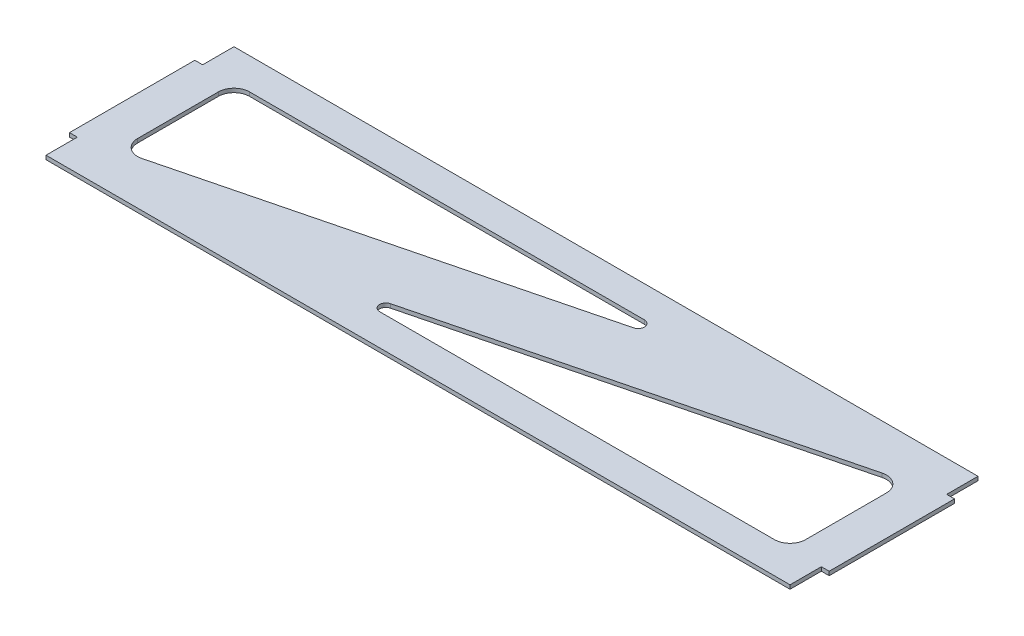
ISO-10303-21;
HEADER;
FILE_DESCRIPTION(('STEP AP214'),'2;1');
FILE_NAME('part.step','',(''),(''),'','','');
FILE_SCHEMA(('AUTOMOTIVE_DESIGN { 1 0 10303 214 1 1 1 1 }'));
ENDSEC;
DATA;
#1=APPLICATION_CONTEXT('core data for automotive mechanical design processes');
#2=APPLICATION_PROTOCOL_DEFINITION('international standard','automotive_design',2000,#1);
#3=PRODUCT_CONTEXT('',#1,'mechanical');
#4=PRODUCT('Part','Part','',(#3));
#5=PRODUCT_RELATED_PRODUCT_CATEGORY('part','',(#4));
#6=PRODUCT_DEFINITION_FORMATION('','',#4);
#7=PRODUCT_DEFINITION_CONTEXT('part definition',#1,'design');
#8=PRODUCT_DEFINITION('design','',#6,#7);
#9=PRODUCT_DEFINITION_SHAPE('','',#8);
#10=(LENGTH_UNIT() NAMED_UNIT(*) SI_UNIT(.MILLI.,.METRE.));
#11=(NAMED_UNIT(*) PLANE_ANGLE_UNIT() SI_UNIT($,.RADIAN.));
#12=(NAMED_UNIT(*) SI_UNIT($,.STERADIAN.) SOLID_ANGLE_UNIT());
#13=UNCERTAINTY_MEASURE_WITH_UNIT(LENGTH_MEASURE(1.E-05),#10,'distance_accuracy_value','');
#14=(GEOMETRIC_REPRESENTATION_CONTEXT(3) GLOBAL_UNCERTAINTY_ASSIGNED_CONTEXT((#13)) GLOBAL_UNIT_ASSIGNED_CONTEXT((#10,
#11,#12)) REPRESENTATION_CONTEXT('',''));
#15=CARTESIAN_POINT('',(0.,0.,0.));
#16=DIRECTION('',(0.,0.,1.));
#17=DIRECTION('',(1.,0.,0.));
#18=AXIS2_PLACEMENT_3D('',#15,#16,#17);
#19=CARTESIAN_POINT('',(-150.8125,1.5875,0.));
#20=DIRECTION('',(-1.,0.,0.));
#21=DIRECTION('',(0.,0.,1.));
#22=AXIS2_PLACEMENT_3D('',#19,#20,#21);
#23=PLANE('',#22);
#24=DIRECTION('',(0.,0.,-1.));
#25=VECTOR('',#24,1.);
#26=CARTESIAN_POINT('',(-150.8125,0.,0.));
#27=LINE('',#26,#25);
#28=CARTESIAN_POINT('',(-150.8125,0.,-25.4));
#29=VERTEX_POINT('',#28);
#30=CARTESIAN_POINT('',(-150.8125,0.,-38.1));
#31=VERTEX_POINT('',#30);
#32=EDGE_CURVE('E324',#29,#31,#27,.T.);
#33=ORIENTED_EDGE('',*,*,#32,.F.);
#34=DIRECTION('',(0.,-1.,0.));
#35=VECTOR('',#34,1.);
#36=CARTESIAN_POINT('',(-150.8125,1.5875,-25.4));
#37=LINE('',#36,#35);
#38=CARTESIAN_POINT('',(-150.8125,1.5875,-25.4));
#39=VERTEX_POINT('',#38);
#40=EDGE_CURVE('E11',#39,#29,#37,.T.);
#41=ORIENTED_EDGE('',*,*,#40,.F.);
#42=DIRECTION('',(0.,0.,-1.));
#43=VECTOR('',#42,1.);
#44=CARTESIAN_POINT('',(-150.8125,1.5875,0.));
#45=LINE('',#44,#43);
#46=CARTESIAN_POINT('',(-150.8125,1.5875,-38.1));
#47=VERTEX_POINT('',#46);
#48=EDGE_CURVE('E339',#39,#47,#45,.T.);
#49=ORIENTED_EDGE('',*,*,#48,.T.);
#50=DIRECTION('',(0.,-1.,0.));
#51=VECTOR('',#50,1.);
#52=CARTESIAN_POINT('',(-150.8125,1.5875,-38.1));
#53=LINE('',#52,#51);
#54=EDGE_CURVE('E379',#47,#31,#53,.T.);
#55=ORIENTED_EDGE('',*,*,#54,.T.);
#56=EDGE_LOOP('',(#33,#41,#49,#55));
#57=FACE_BOUND('',#56,.T.);
#58=ADVANCED_FACE('F41',(#57),#23,.T.);
#59=CARTESIAN_POINT('',(0.,1.5875,-25.4));
#60=DIRECTION('',(0.,0.,1.));
#61=DIRECTION('',(1.,0.,0.));
#62=AXIS2_PLACEMENT_3D('',#59,#60,#61);
#63=PLANE('',#62);
#64=DIRECTION('',(-1.,0.,0.));
#65=VECTOR('',#64,1.);
#66=CARTESIAN_POINT('',(0.,0.,-25.4));
#67=LINE('',#66,#65);
#68=CARTESIAN_POINT('',(-153.9875,0.,-25.4));
#69=VERTEX_POINT('',#68);
#70=EDGE_CURVE('E383',#29,#69,#67,.T.);
#71=ORIENTED_EDGE('',*,*,#70,.T.);
#72=DIRECTION('',(0.,-1.,0.));
#73=VECTOR('',#72,1.);
#74=CARTESIAN_POINT('',(-153.9875,1.5875,-25.4));
#75=LINE('',#74,#73);
#76=CARTESIAN_POINT('',(-153.9875,1.5875,-25.4));
#77=VERTEX_POINT('',#76);
#78=EDGE_CURVE('E49',#77,#69,#75,.T.);
#79=ORIENTED_EDGE('',*,*,#78,.F.);
#80=DIRECTION('',(-1.,0.,0.));
#81=VECTOR('',#80,1.);
#82=CARTESIAN_POINT('',(0.,1.5875,-25.4));
#83=LINE('',#82,#81);
#84=EDGE_CURVE('E343',#39,#77,#83,.T.);
#85=ORIENTED_EDGE('',*,*,#84,.F.);
#86=ORIENTED_EDGE('',*,*,#40,.T.);
#87=EDGE_LOOP('',(#71,#79,#85,#86));
#88=FACE_BOUND('',#87,.T.);
#89=ADVANCED_FACE('F478',(#88),#63,.F.);
#90=CARTESIAN_POINT('',(-153.9875,1.5875,0.));
#91=DIRECTION('',(1.,0.,0.));
#92=DIRECTION('',(0.,0.,-1.));
#93=AXIS2_PLACEMENT_3D('',#90,#91,#92);
#94=PLANE('',#93);
#95=DIRECTION('',(0.,0.,1.));
#96=VECTOR('',#95,1.);
#97=CARTESIAN_POINT('',(-153.9875,0.,0.));
#98=LINE('',#97,#96);
#99=CARTESIAN_POINT('',(-153.9875,0.,25.4));
#100=VERTEX_POINT('',#99);
#101=EDGE_CURVE('E386',#69,#100,#98,.T.);
#102=ORIENTED_EDGE('',*,*,#101,.T.);
#103=DIRECTION('',(0.,-1.,0.));
#104=VECTOR('',#103,1.);
#105=CARTESIAN_POINT('',(-153.9875,1.5875,25.4));
#106=LINE('',#105,#104);
#107=CARTESIAN_POINT('',(-153.9875,1.5875,25.4));
#108=VERTEX_POINT('',#107);
#109=EDGE_CURVE('E450',#108,#100,#106,.T.);
#110=ORIENTED_EDGE('',*,*,#109,.F.);
#111=DIRECTION('',(0.,0.,1.));
#112=VECTOR('',#111,1.);
#113=CARTESIAN_POINT('',(-153.9875,1.5875,0.));
#114=LINE('',#113,#112);
#115=EDGE_CURVE('E347',#77,#108,#114,.T.);
#116=ORIENTED_EDGE('',*,*,#115,.F.);
#117=ORIENTED_EDGE('',*,*,#78,.T.);
#118=EDGE_LOOP('',(#102,#110,#116,#117));
#119=FACE_BOUND('',#118,.T.);
#120=ADVANCED_FACE('F459',(#119),#94,.F.);
#121=CARTESIAN_POINT('',(0.,1.5875,25.4));
#122=DIRECTION('',(0.,0.,-1.));
#123=DIRECTION('',(-1.,0.,0.));
#124=AXIS2_PLACEMENT_3D('',#121,#122,#123);
#125=PLANE('',#124);
#126=DIRECTION('',(1.,0.,0.));
#127=VECTOR('',#126,1.);
#128=CARTESIAN_POINT('',(0.,0.,25.4));
#129=LINE('',#128,#127);
#130=CARTESIAN_POINT('',(-150.8125,0.,25.4));
#131=VERTEX_POINT('',#130);
#132=EDGE_CURVE('E389',#100,#131,#129,.T.);
#133=ORIENTED_EDGE('',*,*,#132,.T.);
#134=DIRECTION('',(0.,-1.,0.));
#135=VECTOR('',#134,1.);
#136=CARTESIAN_POINT('',(-150.8125,1.5875,25.4));
#137=LINE('',#136,#135);
#138=CARTESIAN_POINT('',(-150.8125,1.5875,25.4));
#139=VERTEX_POINT('',#138);
#140=EDGE_CURVE('E447',#139,#131,#137,.T.);
#141=ORIENTED_EDGE('',*,*,#140,.F.);
#142=DIRECTION('',(1.,0.,0.));
#143=VECTOR('',#142,1.);
#144=CARTESIAN_POINT('',(0.,1.5875,25.4));
#145=LINE('',#144,#143);
#146=EDGE_CURVE('E350',#108,#139,#145,.T.);
#147=ORIENTED_EDGE('',*,*,#146,.F.);
#148=ORIENTED_EDGE('',*,*,#109,.T.);
#149=EDGE_LOOP('',(#133,#141,#147,#148));
#150=FACE_BOUND('',#149,.T.);
#151=ADVANCED_FACE('F471',(#150),#125,.F.);
#152=CARTESIAN_POINT('',(-150.8125,1.5875,0.));
#153=DIRECTION('',(-1.,0.,0.));
#154=DIRECTION('',(0.,0.,1.));
#155=AXIS2_PLACEMENT_3D('',#152,#153,#154);
#156=PLANE('',#155);
#157=DIRECTION('',(0.,0.,-1.));
#158=VECTOR('',#157,1.);
#159=CARTESIAN_POINT('',(-150.8125,0.,0.));
#160=LINE('',#159,#158);
#161=CARTESIAN_POINT('',(-150.8125,0.,38.1));
#162=VERTEX_POINT('',#161);
#163=EDGE_CURVE('E393',#162,#131,#160,.T.);
#164=ORIENTED_EDGE('',*,*,#163,.F.);
#165=DIRECTION('',(0.,-1.,0.));
#166=VECTOR('',#165,1.);
#167=CARTESIAN_POINT('',(-150.8125,1.5875,38.1));
#168=LINE('',#167,#166);
#169=CARTESIAN_POINT('',(-150.8125,1.5875,38.1));
#170=VERTEX_POINT('',#169);
#171=EDGE_CURVE('E444',#170,#162,#168,.T.);
#172=ORIENTED_EDGE('',*,*,#171,.F.);
#173=DIRECTION('',(0.,0.,-1.));
#174=VECTOR('',#173,1.);
#175=CARTESIAN_POINT('',(-150.8125,1.5875,0.));
#176=LINE('',#175,#174);
#177=EDGE_CURVE('E353',#170,#139,#176,.T.);
#178=ORIENTED_EDGE('',*,*,#177,.T.);
#179=ORIENTED_EDGE('',*,*,#140,.T.);
#180=EDGE_LOOP('',(#164,#172,#178,#179));
#181=FACE_BOUND('',#180,.T.);
#182=ADVANCED_FACE('F513',(#181),#156,.T.);
#183=CARTESIAN_POINT('',(0.,1.5875,38.1));
#184=DIRECTION('',(0.,0.,-1.));
#185=DIRECTION('',(-1.,0.,0.));
#186=AXIS2_PLACEMENT_3D('',#183,#184,#185);
#187=PLANE('',#186);
#188=DIRECTION('',(1.,0.,0.));
#189=VECTOR('',#188,1.);
#190=CARTESIAN_POINT('',(0.,0.,38.1));
#191=LINE('',#190,#189);
#192=CARTESIAN_POINT('',(150.8125,0.,38.1));
#193=VERTEX_POINT('',#192);
#194=EDGE_CURVE('E397',#162,#193,#191,.T.);
#195=ORIENTED_EDGE('',*,*,#194,.T.);
#196=DIRECTION('',(0.,-1.,0.));
#197=VECTOR('',#196,1.);
#198=CARTESIAN_POINT('',(150.8125,1.5875,38.1));
#199=LINE('',#198,#197);
#200=CARTESIAN_POINT('',(150.8125,1.5875,38.1));
#201=VERTEX_POINT('',#200);
#202=EDGE_CURVE('E440',#201,#193,#199,.T.);
#203=ORIENTED_EDGE('',*,*,#202,.F.);
#204=DIRECTION('',(1.,0.,0.));
#205=VECTOR('',#204,1.);
#206=CARTESIAN_POINT('',(0.,1.5875,38.1));
#207=LINE('',#206,#205);
#208=EDGE_CURVE('E357',#170,#201,#207,.T.);
#209=ORIENTED_EDGE('',*,*,#208,.F.);
#210=ORIENTED_EDGE('',*,*,#171,.T.);
#211=EDGE_LOOP('',(#195,#203,#209,#210));
#212=FACE_BOUND('',#211,.T.);
#213=ADVANCED_FACE('F511',(#212),#187,.F.);
#214=CARTESIAN_POINT('',(150.8125,1.5875,0.));
#215=DIRECTION('',(-1.,0.,0.));
#216=DIRECTION('',(0.,0.,1.));
#217=AXIS2_PLACEMENT_3D('',#214,#215,#216);
#218=PLANE('',#217);
#219=DIRECTION('',(0.,0.,-1.));
#220=VECTOR('',#219,1.);
#221=CARTESIAN_POINT('',(150.8125,0.,0.));
#222=LINE('',#221,#220);
#223=CARTESIAN_POINT('',(150.8125,0.,25.4));
#224=VERTEX_POINT('',#223);
#225=EDGE_CURVE('E400',#193,#224,#222,.T.);
#226=ORIENTED_EDGE('',*,*,#225,.T.);
#227=DIRECTION('',(0.,-1.,0.));
#228=VECTOR('',#227,1.);
#229=CARTESIAN_POINT('',(150.8125,1.5875,25.4));
#230=LINE('',#229,#228);
#231=CARTESIAN_POINT('',(150.8125,1.5875,25.4));
#232=VERTEX_POINT('',#231);
#233=EDGE_CURVE('E436',#232,#224,#230,.T.);
#234=ORIENTED_EDGE('',*,*,#233,.F.);
#235=DIRECTION('',(0.,0.,-1.));
#236=VECTOR('',#235,1.);
#237=CARTESIAN_POINT('',(150.8125,1.5875,0.));
#238=LINE('',#237,#236);
#239=EDGE_CURVE('E360',#201,#232,#238,.T.);
#240=ORIENTED_EDGE('',*,*,#239,.F.);
#241=ORIENTED_EDGE('',*,*,#202,.T.);
#242=EDGE_LOOP('',(#226,#234,#240,#241));
#243=FACE_BOUND('',#242,.T.);
#244=ADVANCED_FACE('F506',(#243),#218,.F.);
#245=CARTESIAN_POINT('',(0.,1.5875,25.4));
#246=DIRECTION('',(0.,0.,-1.));
#247=DIRECTION('',(-1.,0.,0.));
#248=AXIS2_PLACEMENT_3D('',#245,#246,#247);
#249=PLANE('',#248);
#250=DIRECTION('',(1.,0.,0.));
#251=VECTOR('',#250,1.);
#252=CARTESIAN_POINT('',(0.,0.,25.4));
#253=LINE('',#252,#251);
#254=CARTESIAN_POINT('',(153.9875,0.,25.4));
#255=VERTEX_POINT('',#254);
#256=EDGE_CURVE('E403',#224,#255,#253,.T.);
#257=ORIENTED_EDGE('',*,*,#256,.T.);
#258=DIRECTION('',(0.,-1.,0.));
#259=VECTOR('',#258,1.);
#260=CARTESIAN_POINT('',(153.9875,1.5875,25.4));
#261=LINE('',#260,#259);
#262=CARTESIAN_POINT('',(153.9875,1.5875,25.4));
#263=VERTEX_POINT('',#262);
#264=EDGE_CURVE('E432',#263,#255,#261,.T.);
#265=ORIENTED_EDGE('',*,*,#264,.F.);
#266=DIRECTION('',(1.,0.,0.));
#267=VECTOR('',#266,1.);
#268=CARTESIAN_POINT('',(0.,1.5875,25.4));
#269=LINE('',#268,#267);
#270=EDGE_CURVE('E363',#232,#263,#269,.T.);
#271=ORIENTED_EDGE('',*,*,#270,.F.);
#272=ORIENTED_EDGE('',*,*,#233,.T.);
#273=EDGE_LOOP('',(#257,#265,#271,#272));
#274=FACE_BOUND('',#273,.T.);
#275=ADVANCED_FACE('F502',(#274),#249,.F.);
#276=CARTESIAN_POINT('',(153.9875,1.5875,0.));
#277=DIRECTION('',(-1.,0.,0.));
#278=DIRECTION('',(0.,0.,1.));
#279=AXIS2_PLACEMENT_3D('',#276,#277,#278);
#280=PLANE('',#279);
#281=DIRECTION('',(0.,0.,-1.));
#282=VECTOR('',#281,1.);
#283=CARTESIAN_POINT('',(153.9875,0.,0.));
#284=LINE('',#283,#282);
#285=CARTESIAN_POINT('',(153.9875,0.,-25.4));
#286=VERTEX_POINT('',#285);
#287=EDGE_CURVE('E406',#255,#286,#284,.T.);
#288=ORIENTED_EDGE('',*,*,#287,.T.);
#289=DIRECTION('',(0.,-1.,0.));
#290=VECTOR('',#289,1.);
#291=CARTESIAN_POINT('',(153.9875,1.5875,-25.4));
#292=LINE('',#291,#290);
#293=CARTESIAN_POINT('',(153.9875,1.5875,-25.4));
#294=VERTEX_POINT('',#293);
#295=EDGE_CURVE('E428',#294,#286,#292,.T.);
#296=ORIENTED_EDGE('',*,*,#295,.F.);
#297=DIRECTION('',(0.,0.,-1.));
#298=VECTOR('',#297,1.);
#299=CARTESIAN_POINT('',(153.9875,1.5875,0.));
#300=LINE('',#299,#298);
#301=EDGE_CURVE('E366',#263,#294,#300,.T.);
#302=ORIENTED_EDGE('',*,*,#301,.F.);
#303=ORIENTED_EDGE('',*,*,#264,.T.);
#304=EDGE_LOOP('',(#288,#296,#302,#303));
#305=FACE_BOUND('',#304,.T.);
#306=ADVANCED_FACE('F498',(#305),#280,.F.);
#307=CARTESIAN_POINT('',(0.,1.5875,-25.4));
#308=DIRECTION('',(0.,0.,1.));
#309=DIRECTION('',(1.,0.,0.));
#310=AXIS2_PLACEMENT_3D('',#307,#308,#309);
#311=PLANE('',#310);
#312=DIRECTION('',(-1.,0.,0.));
#313=VECTOR('',#312,1.);
#314=CARTESIAN_POINT('',(0.,0.,-25.4));
#315=LINE('',#314,#313);
#316=CARTESIAN_POINT('',(150.8125,0.,-25.4));
#317=VERTEX_POINT('',#316);
#318=EDGE_CURVE('E409',#286,#317,#315,.T.);
#319=ORIENTED_EDGE('',*,*,#318,.T.);
#320=DIRECTION('',(0.,-1.,0.));
#321=VECTOR('',#320,1.);
#322=CARTESIAN_POINT('',(150.8125,1.5875,-25.4));
#323=LINE('',#322,#321);
#324=CARTESIAN_POINT('',(150.8125,1.5875,-25.4));
#325=VERTEX_POINT('',#324);
#326=EDGE_CURVE('E424',#325,#317,#323,.T.);
#327=ORIENTED_EDGE('',*,*,#326,.F.);
#328=DIRECTION('',(-1.,0.,0.));
#329=VECTOR('',#328,1.);
#330=CARTESIAN_POINT('',(0.,1.5875,-25.4));
#331=LINE('',#330,#329);
#332=EDGE_CURVE('E369',#294,#325,#331,.T.);
#333=ORIENTED_EDGE('',*,*,#332,.F.);
#334=ORIENTED_EDGE('',*,*,#295,.T.);
#335=EDGE_LOOP('',(#319,#327,#333,#334));
#336=FACE_BOUND('',#335,.T.);
#337=ADVANCED_FACE('F493',(#336),#311,.F.);
#338=CARTESIAN_POINT('',(150.8125,1.5875,0.));
#339=DIRECTION('',(-1.,0.,0.));
#340=DIRECTION('',(0.,0.,1.));
#341=AXIS2_PLACEMENT_3D('',#338,#339,#340);
#342=PLANE('',#341);
#343=DIRECTION('',(0.,0.,-1.));
#344=VECTOR('',#343,1.);
#345=CARTESIAN_POINT('',(150.8125,0.,0.));
#346=LINE('',#345,#344);
#347=CARTESIAN_POINT('',(150.8125,0.,-38.1));
#348=VERTEX_POINT('',#347);
#349=EDGE_CURVE('E412',#317,#348,#346,.T.);
#350=ORIENTED_EDGE('',*,*,#349,.T.);
#351=DIRECTION('',(0.,-1.,0.));
#352=VECTOR('',#351,1.);
#353=CARTESIAN_POINT('',(150.8125,1.5875,-38.1));
#354=LINE('',#353,#352);
#355=CARTESIAN_POINT('',(150.8125,1.5875,-38.1));
#356=VERTEX_POINT('',#355);
#357=EDGE_CURVE('E421',#356,#348,#354,.T.);
#358=ORIENTED_EDGE('',*,*,#357,.F.);
#359=DIRECTION('',(0.,0.,-1.));
#360=VECTOR('',#359,1.);
#361=CARTESIAN_POINT('',(150.8125,1.5875,0.));
#362=LINE('',#361,#360);
#363=EDGE_CURVE('E372',#325,#356,#362,.T.);
#364=ORIENTED_EDGE('',*,*,#363,.F.);
#365=ORIENTED_EDGE('',*,*,#326,.T.);
#366=EDGE_LOOP('',(#350,#358,#364,#365));
#367=FACE_BOUND('',#366,.T.);
#368=ADVANCED_FACE('F487',(#367),#342,.F.);
#369=CARTESIAN_POINT('',(0.,1.5875,-38.1));
#370=DIRECTION('',(0.,0.,-1.));
#371=DIRECTION('',(-1.,0.,0.));
#372=AXIS2_PLACEMENT_3D('',#369,#370,#371);
#373=PLANE('',#372);
#374=DIRECTION('',(1.,0.,0.));
#375=VECTOR('',#374,1.);
#376=CARTESIAN_POINT('',(0.,0.,-38.1));
#377=LINE('',#376,#375);
#378=EDGE_CURVE('E344',#31,#348,#377,.T.);
#379=ORIENTED_EDGE('',*,*,#378,.F.);
#380=ORIENTED_EDGE('',*,*,#54,.F.);
#381=DIRECTION('',(1.,0.,0.));
#382=VECTOR('',#381,1.);
#383=CARTESIAN_POINT('',(0.,1.5875,-38.1));
#384=LINE('',#383,#382);
#385=EDGE_CURVE('E375',#47,#356,#384,.T.);
#386=ORIENTED_EDGE('',*,*,#385,.T.);
#387=ORIENTED_EDGE('',*,*,#357,.T.);
#388=EDGE_LOOP('',(#379,#380,#386,#387));
#389=FACE_BOUND('',#388,.T.);
#390=ADVANCED_FACE('F483',(#389),#373,.T.);
#391=CARTESIAN_POINT('',(0.,1.5875,0.));
#392=DIRECTION('',(0.,1.,0.));
#393=DIRECTION('',(0.,0.,1.));
#394=AXIS2_PLACEMENT_3D('',#391,#392,#393);
#395=PLANE('',#394);
#396=CARTESIAN_POINT('',(-28.2672201468845,1.5875,22.86));
#397=DIRECTION('',(0.,1.,0.));
#398=DIRECTION('',(0.,0.,1.));
#399=AXIS2_PLACEMENT_3D('',#396,#397,#398);
#400=CIRCLE('',#399,2.54);
#401=CARTESIAN_POINT('',(-28.8893581393748,1.5875,20.3973704463927));
#402=VERTEX_POINT('',#401);
#403=CARTESIAN_POINT('',(-28.2672201468845,1.5875,25.4));
#404=VERTEX_POINT('',#403);
#405=EDGE_CURVE('E56',#402,#404,#400,.T.);
#406=ORIENTED_EDGE('',*,*,#405,.F.);
#407=DIRECTION('',(-0.96953919433359,0.,0.244936217515854));
#408=VECTOR('',#407,1.);
#409=CARTESIAN_POINT('',(130.207155018774,1.5875,-19.7954328777713));
#410=LINE('',#409,#408);
#411=CARTESIAN_POINT('',(130.207155018774,1.5875,-19.7954328777713));
#412=VERTEX_POINT('',#411);
#413=EDGE_CURVE('E226',#412,#402,#410,.T.);
#414=ORIENTED_EDGE('',*,*,#413,.F.);
#415=CARTESIAN_POINT('',(131.7625,1.5875,-13.638858993753));
#416=DIRECTION('',(0.,1.,0.));
#417=DIRECTION('',(0.,0.,1.));
#418=AXIS2_PLACEMENT_3D('',#415,#416,#417);
#419=CIRCLE('',#418,6.35);
#420=CARTESIAN_POINT('',(138.1125,1.5875,-13.638858993753));
#421=VERTEX_POINT('',#420);
#422=EDGE_CURVE('E230',#421,#412,#419,.T.);
#423=ORIENTED_EDGE('',*,*,#422,.F.);
#424=DIRECTION('',(0.,0.,-1.));
#425=VECTOR('',#424,1.);
#426=CARTESIAN_POINT('',(138.1125,1.5875,19.05));
#427=LINE('',#426,#425);
#428=CARTESIAN_POINT('',(138.1125,1.5875,19.05));
#429=VERTEX_POINT('',#428);
#430=EDGE_CURVE('E253',#429,#421,#427,.T.);
#431=ORIENTED_EDGE('',*,*,#430,.F.);
#432=CARTESIAN_POINT('',(131.7625,1.5875,19.05));
#433=DIRECTION('',(0.,1.,0.));
#434=DIRECTION('',(0.,0.,-1.));
#435=AXIS2_PLACEMENT_3D('',#432,#433,#434);
#436=CIRCLE('',#435,6.34999999999998);
#437=CARTESIAN_POINT('',(131.7625,1.5875,25.4));
#438=VERTEX_POINT('',#437);
#439=EDGE_CURVE('E249',#438,#429,#436,.T.);
#440=ORIENTED_EDGE('',*,*,#439,.F.);
#441=DIRECTION('',(1.,0.,0.));
#442=VECTOR('',#441,1.);
#443=CARTESIAN_POINT('',(-28.2672201468845,1.5875,25.4));
#444=LINE('',#443,#442);
#445=EDGE_CURVE('E246',#404,#438,#444,.T.);
#446=ORIENTED_EDGE('',*,*,#445,.F.);
#447=EDGE_LOOP('',(#406,#414,#423,#431,#440,#446));
#448=FACE_BOUND('',#447,.T.);
#449=CARTESIAN_POINT('',(-131.7625,1.5875,13.638858993753));
#450=DIRECTION('',(0.,1.,0.));
#451=DIRECTION('',(0.,0.,1.));
#452=AXIS2_PLACEMENT_3D('',#449,#450,#451);
#453=CIRCLE('',#452,6.35);
#454=CARTESIAN_POINT('',(-138.1125,1.5875,13.638858993753));
#455=VERTEX_POINT('',#454);
#456=CARTESIAN_POINT('',(-130.207155018774,1.5875,19.7954328777713));
#457=VERTEX_POINT('',#456);
#458=EDGE_CURVE('E64',#455,#457,#453,.T.);
#459=ORIENTED_EDGE('',*,*,#458,.F.);
#460=DIRECTION('',(0.,0.,1.));
#461=VECTOR('',#460,1.);
#462=CARTESIAN_POINT('',(-138.1125,1.5875,-19.05));
#463=LINE('',#462,#461);
#464=CARTESIAN_POINT('',(-138.1125,1.5875,-19.05));
#465=VERTEX_POINT('',#464);
#466=EDGE_CURVE('E279',#465,#455,#463,.T.);
#467=ORIENTED_EDGE('',*,*,#466,.F.);
#468=CARTESIAN_POINT('',(-131.7625,1.5875,-19.05));
#469=DIRECTION('',(0.,1.,0.));
#470=DIRECTION('',(0.,0.,-1.));
#471=AXIS2_PLACEMENT_3D('',#468,#469,#470);
#472=CIRCLE('',#471,6.34999999999999);
#473=CARTESIAN_POINT('',(-131.7625,1.5875,-25.4));
#474=VERTEX_POINT('',#473);
#475=EDGE_CURVE('E314',#474,#465,#472,.T.);
#476=ORIENTED_EDGE('',*,*,#475,.F.);
#477=DIRECTION('',(-1.,0.,0.));
#478=VECTOR('',#477,1.);
#479=CARTESIAN_POINT('',(28.2672201468845,1.5875,-25.4));
#480=LINE('',#479,#478);
#481=CARTESIAN_POINT('',(28.2672201468845,1.5875,-25.4));
#482=VERTEX_POINT('',#481);
#483=EDGE_CURVE('E310',#482,#474,#480,.T.);
#484=ORIENTED_EDGE('',*,*,#483,.F.);
#485=CARTESIAN_POINT('',(28.2672201468845,1.5875,-22.86));
#486=DIRECTION('',(0.,1.,0.));
#487=DIRECTION('',(0.,0.,1.));
#488=AXIS2_PLACEMENT_3D('',#485,#486,#487);
#489=CIRCLE('',#488,2.54);
#490=CARTESIAN_POINT('',(28.8893581393748,1.5875,-20.3973704463927));
#491=VERTEX_POINT('',#490);
#492=EDGE_CURVE('E306',#491,#482,#489,.T.);
#493=ORIENTED_EDGE('',*,*,#492,.F.);
#494=DIRECTION('',(0.96953919433359,0.,-0.244936217515854));
#495=VECTOR('',#494,1.);
#496=CARTESIAN_POINT('',(-130.207155018774,1.5875,19.7954328777713));
#497=LINE('',#496,#495);
#498=EDGE_CURVE('E302',#457,#491,#497,.T.);
#499=ORIENTED_EDGE('',*,*,#498,.F.);
#500=EDGE_LOOP('',(#459,#467,#476,#484,#493,#499));
#501=FACE_BOUND('',#500,.T.);
#502=ORIENTED_EDGE('',*,*,#48,.F.);
#503=ORIENTED_EDGE('',*,*,#84,.T.);
#504=ORIENTED_EDGE('',*,*,#115,.T.);
#505=ORIENTED_EDGE('',*,*,#146,.T.);
#506=ORIENTED_EDGE('',*,*,#177,.F.);
#507=ORIENTED_EDGE('',*,*,#208,.T.);
#508=ORIENTED_EDGE('',*,*,#239,.T.);
#509=ORIENTED_EDGE('',*,*,#270,.T.);
#510=ORIENTED_EDGE('',*,*,#301,.T.);
#511=ORIENTED_EDGE('',*,*,#332,.T.);
#512=ORIENTED_EDGE('',*,*,#363,.T.);
#513=ORIENTED_EDGE('',*,*,#385,.F.);
#514=EDGE_LOOP('',(#502,#503,#504,#505,#506,#507,#508,#509,#510,#511,#512,#513));
#515=FACE_BOUND('',#514,.T.);
#516=ADVANCED_FACE('F476',(#448,#501,#515),#395,.T.);
#517=CARTESIAN_POINT('',(0.,0.,0.));
#518=DIRECTION('',(0.,1.,0.));
#519=DIRECTION('',(0.,0.,1.));
#520=AXIS2_PLACEMENT_3D('',#517,#518,#519);
#521=PLANE('',#520);
#522=DIRECTION('',(-0.96953919433359,0.,0.244936217515854));
#523=VECTOR('',#522,1.);
#524=CARTESIAN_POINT('',(130.207155018774,0.,-19.7954328777713));
#525=LINE('',#524,#523);
#526=CARTESIAN_POINT('',(130.207155018774,0.,-19.7954328777713));
#527=VERTEX_POINT('',#526);
#528=CARTESIAN_POINT('',(-28.8893581393748,0.,20.3973704463927));
#529=VERTEX_POINT('',#528);
#530=EDGE_CURVE('E210',#527,#529,#525,.T.);
#531=ORIENTED_EDGE('',*,*,#530,.T.);
#532=CARTESIAN_POINT('',(-28.2672201468845,0.,22.86));
#533=DIRECTION('',(0.,1.,0.));
#534=DIRECTION('',(0.,0.,1.));
#535=AXIS2_PLACEMENT_3D('',#532,#533,#534);
#536=CIRCLE('',#535,2.54);
#537=CARTESIAN_POINT('',(-28.2672201468845,0.,25.4));
#538=VERTEX_POINT('',#537);
#539=EDGE_CURVE('E203',#529,#538,#536,.T.);
#540=ORIENTED_EDGE('',*,*,#539,.T.);
#541=DIRECTION('',(1.,0.,0.));
#542=VECTOR('',#541,1.);
#543=CARTESIAN_POINT('',(-28.2672201468845,0.,25.4));
#544=LINE('',#543,#542);
#545=CARTESIAN_POINT('',(131.7625,0.,25.4));
#546=VERTEX_POINT('',#545);
#547=EDGE_CURVE('E214',#538,#546,#544,.T.);
#548=ORIENTED_EDGE('',*,*,#547,.T.);
#549=CARTESIAN_POINT('',(131.7625,0.,19.05));
#550=DIRECTION('',(0.,1.,0.));
#551=DIRECTION('',(0.,0.,-1.));
#552=AXIS2_PLACEMENT_3D('',#549,#550,#551);
#553=CIRCLE('',#552,6.34999999999998);
#554=CARTESIAN_POINT('',(138.1125,0.,19.05));
#555=VERTEX_POINT('',#554);
#556=EDGE_CURVE('E219',#546,#555,#553,.T.);
#557=ORIENTED_EDGE('',*,*,#556,.T.);
#558=DIRECTION('',(0.,0.,-1.));
#559=VECTOR('',#558,1.);
#560=CARTESIAN_POINT('',(138.1125,0.,19.05));
#561=LINE('',#560,#559);
#562=CARTESIAN_POINT('',(138.1125,0.,-13.638858993753));
#563=VERTEX_POINT('',#562);
#564=EDGE_CURVE('E235',#555,#563,#561,.T.);
#565=ORIENTED_EDGE('',*,*,#564,.T.);
#566=CARTESIAN_POINT('',(131.7625,0.,-13.638858993753));
#567=DIRECTION('',(0.,1.,0.));
#568=DIRECTION('',(0.,0.,1.));
#569=AXIS2_PLACEMENT_3D('',#566,#567,#568);
#570=CIRCLE('',#569,6.35);
#571=EDGE_CURVE('E239',#563,#527,#570,.T.);
#572=ORIENTED_EDGE('',*,*,#571,.T.);
#573=EDGE_LOOP('',(#531,#540,#548,#557,#565,#572));
#574=FACE_BOUND('',#573,.T.);
#575=DIRECTION('',(0.,0.,1.));
#576=VECTOR('',#575,1.);
#577=CARTESIAN_POINT('',(-138.1125,0.,-19.05));
#578=LINE('',#577,#576);
#579=CARTESIAN_POINT('',(-138.1125,0.,-19.05));
#580=VERTEX_POINT('',#579);
#581=CARTESIAN_POINT('',(-138.1125,0.,13.638858993753));
#582=VERTEX_POINT('',#581);
#583=EDGE_CURVE('E295',#580,#582,#578,.T.);
#584=ORIENTED_EDGE('',*,*,#583,.T.);
#585=CARTESIAN_POINT('',(-131.7625,0.,13.638858993753));
#586=DIRECTION('',(0.,1.,0.));
#587=DIRECTION('',(0.,0.,1.));
#588=AXIS2_PLACEMENT_3D('',#585,#586,#587);
#589=CIRCLE('',#588,6.35);
#590=CARTESIAN_POINT('',(-130.207155018774,0.,19.7954328777713));
#591=VERTEX_POINT('',#590);
#592=EDGE_CURVE('E274',#582,#591,#589,.T.);
#593=ORIENTED_EDGE('',*,*,#592,.T.);
#594=DIRECTION('',(0.96953919433359,0.,-0.244936217515854));
#595=VECTOR('',#594,1.);
#596=CARTESIAN_POINT('',(-130.207155018774,0.,19.7954328777713));
#597=LINE('',#596,#595);
#598=CARTESIAN_POINT('',(28.8893581393748,0.,-20.3973704463927));
#599=VERTEX_POINT('',#598);
#600=EDGE_CURVE('E278',#591,#599,#597,.T.);
#601=ORIENTED_EDGE('',*,*,#600,.T.);
#602=CARTESIAN_POINT('',(28.2672201468845,0.,-22.86));
#603=DIRECTION('',(0.,1.,0.));
#604=DIRECTION('',(0.,0.,1.));
#605=AXIS2_PLACEMENT_3D('',#602,#603,#604);
#606=CIRCLE('',#605,2.54);
#607=CARTESIAN_POINT('',(28.2672201468845,0.,-25.4));
#608=VERTEX_POINT('',#607);
#609=EDGE_CURVE('E283',#599,#608,#606,.T.);
#610=ORIENTED_EDGE('',*,*,#609,.T.);
#611=DIRECTION('',(-1.,0.,0.));
#612=VECTOR('',#611,1.);
#613=CARTESIAN_POINT('',(28.2672201468845,0.,-25.4));
#614=LINE('',#613,#612);
#615=CARTESIAN_POINT('',(-131.7625,0.,-25.4));
#616=VERTEX_POINT('',#615);
#617=EDGE_CURVE('E287',#608,#616,#614,.T.);
#618=ORIENTED_EDGE('',*,*,#617,.T.);
#619=CARTESIAN_POINT('',(-131.7625,0.,-19.05));
#620=DIRECTION('',(0.,1.,0.));
#621=DIRECTION('',(0.,0.,-1.));
#622=AXIS2_PLACEMENT_3D('',#619,#620,#621);
#623=CIRCLE('',#622,6.34999999999999);
#624=EDGE_CURVE('E291',#616,#580,#623,.T.);
#625=ORIENTED_EDGE('',*,*,#624,.T.);
#626=EDGE_LOOP('',(#584,#593,#601,#610,#618,#625));
#627=FACE_BOUND('',#626,.T.);
#628=ORIENTED_EDGE('',*,*,#32,.T.);
#629=ORIENTED_EDGE('',*,*,#378,.T.);
#630=ORIENTED_EDGE('',*,*,#349,.F.);
#631=ORIENTED_EDGE('',*,*,#318,.F.);
#632=ORIENTED_EDGE('',*,*,#287,.F.);
#633=ORIENTED_EDGE('',*,*,#256,.F.);
#634=ORIENTED_EDGE('',*,*,#225,.F.);
#635=ORIENTED_EDGE('',*,*,#194,.F.);
#636=ORIENTED_EDGE('',*,*,#163,.T.);
#637=ORIENTED_EDGE('',*,*,#132,.F.);
#638=ORIENTED_EDGE('',*,*,#101,.F.);
#639=ORIENTED_EDGE('',*,*,#70,.F.);
#640=EDGE_LOOP('',(#628,#629,#630,#631,#632,#633,#634,#635,#636,#637,#638,#639));
#641=FACE_BOUND('',#640,.T.);
#642=ADVANCED_FACE('F221',(#574,#627,#641),#521,.F.);
#643=CARTESIAN_POINT('',(-131.7625,0.,13.638858993753));
#644=DIRECTION('',(0.,1.,0.));
#645=DIRECTION('',(0.,0.,1.));
#646=AXIS2_PLACEMENT_3D('',#643,#644,#645);
#647=CYLINDRICAL_SURFACE('',#646,6.35);
#648=ORIENTED_EDGE('',*,*,#458,.T.);
#649=DIRECTION('',(0.,1.,0.));
#650=VECTOR('',#649,1.);
#651=CARTESIAN_POINT('',(-130.207155018774,0.,19.7954328777713));
#652=LINE('',#651,#650);
#653=EDGE_CURVE('E299',#591,#457,#652,.T.);
#654=ORIENTED_EDGE('',*,*,#653,.F.);
#655=ORIENTED_EDGE('',*,*,#592,.F.);
#656=DIRECTION('',(0.,1.,0.));
#657=VECTOR('',#656,1.);
#658=CARTESIAN_POINT('',(-138.1125,0.,13.638858993753));
#659=LINE('',#658,#657);
#660=EDGE_CURVE('E321',#582,#455,#659,.T.);
#661=ORIENTED_EDGE('',*,*,#660,.T.);
#662=EDGE_LOOP('',(#648,#654,#655,#661));
#663=FACE_BOUND('',#662,.T.);
#664=ADVANCED_FACE('F612',(#663),#647,.F.);
#665=CARTESIAN_POINT('',(-138.1125,0.,-19.05));
#666=DIRECTION('',(-1.,0.,0.));
#667=DIRECTION('',(0.,0.,1.));
#668=AXIS2_PLACEMENT_3D('',#665,#666,#667);
#669=PLANE('',#668);
#670=ORIENTED_EDGE('',*,*,#466,.T.);
#671=ORIENTED_EDGE('',*,*,#660,.F.);
#672=ORIENTED_EDGE('',*,*,#583,.F.);
#673=DIRECTION('',(0.,1.,0.));
#674=VECTOR('',#673,1.);
#675=CARTESIAN_POINT('',(-138.1125,0.,-19.05));
#676=LINE('',#675,#674);
#677=EDGE_CURVE('E325',#580,#465,#676,.T.);
#678=ORIENTED_EDGE('',*,*,#677,.T.);
#679=EDGE_LOOP('',(#670,#671,#672,#678));
#680=FACE_BOUND('',#679,.T.);
#681=ADVANCED_FACE('F621',(#680),#669,.F.);
#682=CARTESIAN_POINT('',(-131.7625,0.,-19.05));
#683=DIRECTION('',(0.,1.,0.));
#684=DIRECTION('',(0.,0.,1.));
#685=AXIS2_PLACEMENT_3D('',#682,#683,#684);
#686=CYLINDRICAL_SURFACE('',#685,6.34999999999999);
#687=ORIENTED_EDGE('',*,*,#475,.T.);
#688=ORIENTED_EDGE('',*,*,#677,.F.);
#689=ORIENTED_EDGE('',*,*,#624,.F.);
#690=DIRECTION('',(0.,1.,0.));
#691=VECTOR('',#690,1.);
#692=CARTESIAN_POINT('',(-131.7625,0.,-25.4));
#693=LINE('',#692,#691);
#694=EDGE_CURVE('E328',#616,#474,#693,.T.);
#695=ORIENTED_EDGE('',*,*,#694,.T.);
#696=EDGE_LOOP('',(#687,#688,#689,#695));
#697=FACE_BOUND('',#696,.T.);
#698=ADVANCED_FACE('F630',(#697),#686,.F.);
#699=CARTESIAN_POINT('',(28.2672201468845,0.,-25.4));
#700=DIRECTION('',(0.,0.,-1.));
#701=DIRECTION('',(-1.,0.,0.));
#702=AXIS2_PLACEMENT_3D('',#699,#700,#701);
#703=PLANE('',#702);
#704=ORIENTED_EDGE('',*,*,#483,.T.);
#705=ORIENTED_EDGE('',*,*,#694,.F.);
#706=ORIENTED_EDGE('',*,*,#617,.F.);
#707=DIRECTION('',(0.,1.,0.));
#708=VECTOR('',#707,1.);
#709=CARTESIAN_POINT('',(28.2672201468845,0.,-25.4));
#710=LINE('',#709,#708);
#711=EDGE_CURVE('E331',#608,#482,#710,.T.);
#712=ORIENTED_EDGE('',*,*,#711,.T.);
#713=EDGE_LOOP('',(#704,#705,#706,#712));
#714=FACE_BOUND('',#713,.T.);
#715=ADVANCED_FACE('F640',(#714),#703,.F.);
#716=CARTESIAN_POINT('',(28.2672201468845,0.,-22.86));
#717=DIRECTION('',(0.,1.,0.));
#718=DIRECTION('',(0.,0.,1.));
#719=AXIS2_PLACEMENT_3D('',#716,#717,#718);
#720=CYLINDRICAL_SURFACE('',#719,2.54);
#721=ORIENTED_EDGE('',*,*,#492,.T.);
#722=ORIENTED_EDGE('',*,*,#711,.F.);
#723=ORIENTED_EDGE('',*,*,#609,.F.);
#724=DIRECTION('',(0.,1.,0.));
#725=VECTOR('',#724,1.);
#726=CARTESIAN_POINT('',(28.8893581393748,0.,-20.3973704463927));
#727=LINE('',#726,#725);
#728=EDGE_CURVE('E334',#599,#491,#727,.T.);
#729=ORIENTED_EDGE('',*,*,#728,.T.);
#730=EDGE_LOOP('',(#721,#722,#723,#729));
#731=FACE_BOUND('',#730,.T.);
#732=ADVANCED_FACE('F650',(#731),#720,.F.);
#733=CARTESIAN_POINT('',(-130.207155018774,0.,19.7954328777713));
#734=DIRECTION('',(0.244936217515854,0.,0.96953919433359));
#735=DIRECTION('',(0.96953919433359,0.,-0.244936217515854));
#736=AXIS2_PLACEMENT_3D('',#733,#734,#735);
#737=PLANE('',#736);
#738=ORIENTED_EDGE('',*,*,#498,.T.);
#739=ORIENTED_EDGE('',*,*,#728,.F.);
#740=ORIENTED_EDGE('',*,*,#600,.F.);
#741=ORIENTED_EDGE('',*,*,#653,.T.);
#742=EDGE_LOOP('',(#738,#739,#740,#741));
#743=FACE_BOUND('',#742,.T.);
#744=ADVANCED_FACE('F660',(#743),#737,.F.);
#745=CARTESIAN_POINT('',(-28.2672201468845,0.,22.86));
#746=DIRECTION('',(0.,1.,0.));
#747=DIRECTION('',(0.,0.,1.));
#748=AXIS2_PLACEMENT_3D('',#745,#746,#747);
#749=CYLINDRICAL_SURFACE('',#748,2.54);
#750=ORIENTED_EDGE('',*,*,#405,.T.);
#751=DIRECTION('',(0.,1.,0.));
#752=VECTOR('',#751,1.);
#753=CARTESIAN_POINT('',(-28.2672201468845,0.,25.4));
#754=LINE('',#753,#752);
#755=EDGE_CURVE('E199',#538,#404,#754,.T.);
#756=ORIENTED_EDGE('',*,*,#755,.F.);
#757=ORIENTED_EDGE('',*,*,#539,.F.);
#758=DIRECTION('',(0.,1.,0.));
#759=VECTOR('',#758,1.);
#760=CARTESIAN_POINT('',(-28.8893581393748,0.,20.3973704463927));
#761=LINE('',#760,#759);
#762=EDGE_CURVE('E260',#529,#402,#761,.T.);
#763=ORIENTED_EDGE('',*,*,#762,.T.);
#764=EDGE_LOOP('',(#750,#756,#757,#763));
#765=FACE_BOUND('',#764,.T.);
#766=ADVANCED_FACE('F201',(#765),#749,.F.);
#767=CARTESIAN_POINT('',(130.207155018774,0.,-19.7954328777713));
#768=DIRECTION('',(-0.244936217515854,0.,-0.96953919433359));
#769=DIRECTION('',(-0.96953919433359,0.,0.244936217515854));
#770=AXIS2_PLACEMENT_3D('',#767,#768,#769);
#771=PLANE('',#770);
#772=ORIENTED_EDGE('',*,*,#413,.T.);
#773=ORIENTED_EDGE('',*,*,#762,.F.);
#774=ORIENTED_EDGE('',*,*,#530,.F.);
#775=DIRECTION('',(0.,1.,0.));
#776=VECTOR('',#775,1.);
#777=CARTESIAN_POINT('',(130.207155018774,0.,-19.7954328777713));
#778=LINE('',#777,#776);
#779=EDGE_CURVE('E263',#527,#412,#778,.T.);
#780=ORIENTED_EDGE('',*,*,#779,.T.);
#781=EDGE_LOOP('',(#772,#773,#774,#780));
#782=FACE_BOUND('',#781,.T.);
#783=ADVANCED_FACE('F679',(#782),#771,.F.);
#784=CARTESIAN_POINT('',(131.7625,0.,-13.638858993753));
#785=DIRECTION('',(0.,1.,0.));
#786=DIRECTION('',(0.,0.,1.));
#787=AXIS2_PLACEMENT_3D('',#784,#785,#786);
#788=CYLINDRICAL_SURFACE('',#787,6.35);
#789=ORIENTED_EDGE('',*,*,#422,.T.);
#790=ORIENTED_EDGE('',*,*,#779,.F.);
#791=ORIENTED_EDGE('',*,*,#571,.F.);
#792=DIRECTION('',(0.,1.,0.));
#793=VECTOR('',#792,1.);
#794=CARTESIAN_POINT('',(138.1125,0.,-13.638858993753));
#795=LINE('',#794,#793);
#796=EDGE_CURVE('E266',#563,#421,#795,.T.);
#797=ORIENTED_EDGE('',*,*,#796,.T.);
#798=EDGE_LOOP('',(#789,#790,#791,#797));
#799=FACE_BOUND('',#798,.T.);
#800=ADVANCED_FACE('F688',(#799),#788,.F.);
#801=CARTESIAN_POINT('',(138.1125,0.,19.05));
#802=DIRECTION('',(1.,0.,0.));
#803=DIRECTION('',(0.,0.,-1.));
#804=AXIS2_PLACEMENT_3D('',#801,#802,#803);
#805=PLANE('',#804);
#806=ORIENTED_EDGE('',*,*,#430,.T.);
#807=ORIENTED_EDGE('',*,*,#796,.F.);
#808=ORIENTED_EDGE('',*,*,#564,.F.);
#809=DIRECTION('',(0.,1.,0.));
#810=VECTOR('',#809,1.);
#811=CARTESIAN_POINT('',(138.1125,0.,19.05));
#812=LINE('',#811,#810);
#813=EDGE_CURVE('E269',#555,#429,#812,.T.);
#814=ORIENTED_EDGE('',*,*,#813,.T.);
#815=EDGE_LOOP('',(#806,#807,#808,#814));
#816=FACE_BOUND('',#815,.T.);
#817=ADVANCED_FACE('F698',(#816),#805,.F.);
#818=CARTESIAN_POINT('',(131.7625,0.,19.05));
#819=DIRECTION('',(0.,1.,0.));
#820=DIRECTION('',(0.,0.,1.));
#821=AXIS2_PLACEMENT_3D('',#818,#819,#820);
#822=CYLINDRICAL_SURFACE('',#821,6.34999999999998);
#823=ORIENTED_EDGE('',*,*,#439,.T.);
#824=ORIENTED_EDGE('',*,*,#813,.F.);
#825=ORIENTED_EDGE('',*,*,#556,.F.);
#826=DIRECTION('',(0.,1.,0.));
#827=VECTOR('',#826,1.);
#828=CARTESIAN_POINT('',(131.7625,0.,25.4));
#829=LINE('',#828,#827);
#830=EDGE_CURVE('E209',#546,#438,#829,.T.);
#831=ORIENTED_EDGE('',*,*,#830,.T.);
#832=EDGE_LOOP('',(#823,#824,#825,#831));
#833=FACE_BOUND('',#832,.T.);
#834=ADVANCED_FACE('F708',(#833),#822,.F.);
#835=CARTESIAN_POINT('',(-28.2672201468845,0.,25.4));
#836=DIRECTION('',(0.,0.,1.));
#837=DIRECTION('',(1.,0.,0.));
#838=AXIS2_PLACEMENT_3D('',#835,#836,#837);
#839=PLANE('',#838);
#840=ORIENTED_EDGE('',*,*,#445,.T.);
#841=ORIENTED_EDGE('',*,*,#830,.F.);
#842=ORIENTED_EDGE('',*,*,#547,.F.);
#843=ORIENTED_EDGE('',*,*,#755,.T.);
#844=EDGE_LOOP('',(#840,#841,#842,#843));
#845=FACE_BOUND('',#844,.T.);
#846=ADVANCED_FACE('F215',(#845),#839,.F.);
#847=CLOSED_SHELL('',(#58,#89,#120,#151,#182,#213,#244,#275,#306,#337,#368,#390,#516,#642,#664,
#681,#698,#715,#732,#744,#766,#783,#800,#817,#834,#846));
#848=MANIFOLD_SOLID_BREP('B2',#847);
#849=ADVANCED_BREP_SHAPE_REPRESENTATION('',(#18,#848),#14);
#850=SHAPE_DEFINITION_REPRESENTATION(#9,#849);
ENDSEC;
END-ISO-10303-21;
